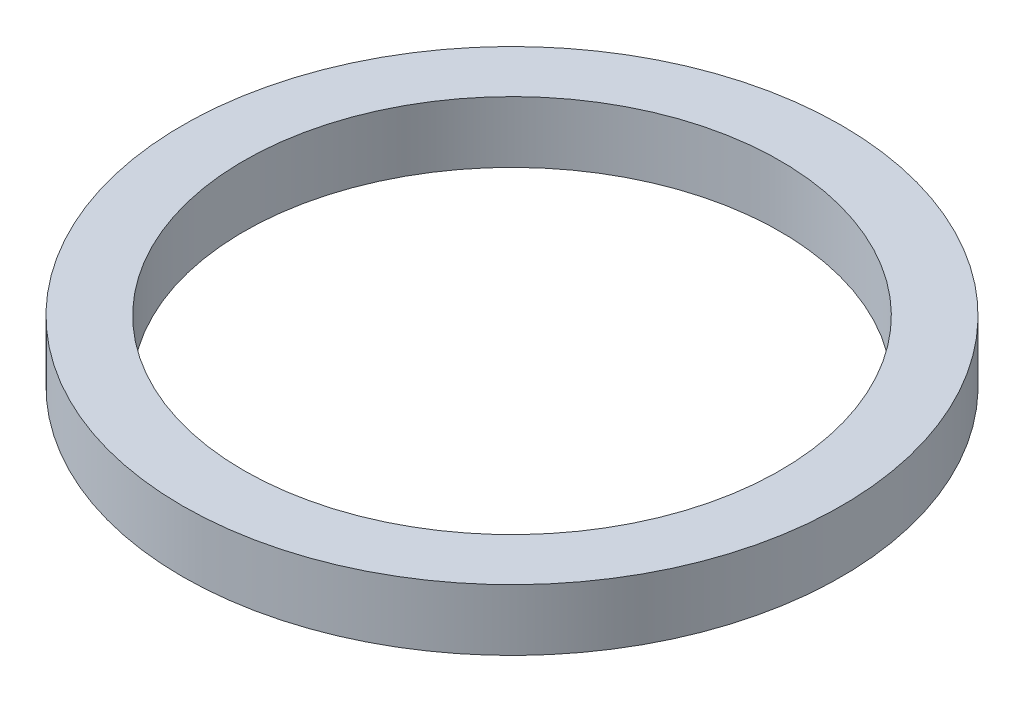
ISO-10303-21;
HEADER;
FILE_DESCRIPTION(('STEP AP214'),'2;1');
FILE_NAME('part.step','',(''),(''),'','','');
FILE_SCHEMA(('AUTOMOTIVE_DESIGN { 1 0 10303 214 1 1 1 1 }'));
ENDSEC;
DATA;
#1=APPLICATION_CONTEXT('core data for automotive mechanical design processes');
#2=APPLICATION_PROTOCOL_DEFINITION('international standard','automotive_design',2000,#1);
#3=PRODUCT_CONTEXT('',#1,'mechanical');
#4=PRODUCT('Part','Part','',(#3));
#5=PRODUCT_RELATED_PRODUCT_CATEGORY('part','',(#4));
#6=PRODUCT_DEFINITION_FORMATION('','',#4);
#7=PRODUCT_DEFINITION_CONTEXT('part definition',#1,'design');
#8=PRODUCT_DEFINITION('design','',#6,#7);
#9=PRODUCT_DEFINITION_SHAPE('','',#8);
#10=(LENGTH_UNIT() NAMED_UNIT(*) SI_UNIT(.MILLI.,.METRE.));
#11=(NAMED_UNIT(*) PLANE_ANGLE_UNIT() SI_UNIT($,.RADIAN.));
#12=(NAMED_UNIT(*) SI_UNIT($,.STERADIAN.) SOLID_ANGLE_UNIT());
#13=UNCERTAINTY_MEASURE_WITH_UNIT(LENGTH_MEASURE(1.E-05),#10,'distance_accuracy_value','');
#14=(GEOMETRIC_REPRESENTATION_CONTEXT(3) GLOBAL_UNCERTAINTY_ASSIGNED_CONTEXT((#13)) GLOBAL_UNIT_ASSIGNED_CONTEXT((#10,
#11,#12)) REPRESENTATION_CONTEXT('',''));
#15=CARTESIAN_POINT('',(0.,0.,0.));
#16=DIRECTION('',(0.,0.,1.));
#17=DIRECTION('',(1.,0.,0.));
#18=AXIS2_PLACEMENT_3D('',#15,#16,#17);
#19=CARTESIAN_POINT('',(0.,8.,0.));
#20=DIRECTION('',(0.,1.,0.));
#21=DIRECTION('',(0.,0.,1.));
#22=AXIS2_PLACEMENT_3D('',#19,#20,#21);
#23=PLANE('',#22);
#24=CARTESIAN_POINT('',(0.,8.,0.));
#25=DIRECTION('',(0.,1.,0.));
#26=DIRECTION('',(0.,0.,1.));
#27=AXIS2_PLACEMENT_3D('',#24,#25,#26);
#28=CIRCLE('',#27,43.);
#29=CARTESIAN_POINT('',(0.,8.,43.));
#30=VERTEX_POINT('',#29);
#31=EDGE_CURVE('E10',#30,#30,#28,.T.);
#32=ORIENTED_EDGE('',*,*,#31,.T.);
#33=EDGE_LOOP('',(#32));
#34=FACE_BOUND('',#33,.T.);
#35=CARTESIAN_POINT('',(0.,8.,0.));
#36=DIRECTION('',(0.,1.,0.));
#37=DIRECTION('',(0.,0.,1.));
#38=AXIS2_PLACEMENT_3D('',#35,#36,#37);
#39=CIRCLE('',#38,35.);
#40=CARTESIAN_POINT('',(0.,8.,35.));
#41=VERTEX_POINT('',#40);
#42=EDGE_CURVE('E48',#41,#41,#39,.T.);
#43=ORIENTED_EDGE('',*,*,#42,.F.);
#44=EDGE_LOOP('',(#43));
#45=FACE_BOUND('',#44,.T.);
#46=ADVANCED_FACE('F37',(#34,#45),#23,.T.);
#47=CARTESIAN_POINT('',(0.,0.,0.));
#48=DIRECTION('',(0.,1.,0.));
#49=DIRECTION('',(0.,0.,1.));
#50=AXIS2_PLACEMENT_3D('',#47,#48,#49);
#51=PLANE('',#50);
#52=CARTESIAN_POINT('',(0.,0.,0.));
#53=DIRECTION('',(0.,1.,0.));
#54=DIRECTION('',(0.,0.,1.));
#55=AXIS2_PLACEMENT_3D('',#52,#53,#54);
#56=CIRCLE('',#55,43.);
#57=CARTESIAN_POINT('',(0.,0.,43.));
#58=VERTEX_POINT('',#57);
#59=EDGE_CURVE('E41',#58,#58,#56,.T.);
#60=ORIENTED_EDGE('',*,*,#59,.F.);
#61=EDGE_LOOP('',(#60));
#62=FACE_BOUND('',#61,.T.);
#63=CARTESIAN_POINT('',(0.,0.,0.));
#64=DIRECTION('',(0.,1.,0.));
#65=DIRECTION('',(0.,0.,1.));
#66=AXIS2_PLACEMENT_3D('',#63,#64,#65);
#67=CIRCLE('',#66,35.);
#68=CARTESIAN_POINT('',(0.,0.,35.));
#69=VERTEX_POINT('',#68);
#70=EDGE_CURVE('E50',#69,#69,#67,.T.);
#71=ORIENTED_EDGE('',*,*,#70,.T.);
#72=EDGE_LOOP('',(#71));
#73=FACE_BOUND('',#72,.T.);
#74=ADVANCED_FACE('F60',(#62,#73),#51,.F.);
#75=CARTESIAN_POINT('',(0.,8.,0.));
#76=DIRECTION('',(0.,-1.,0.));
#77=DIRECTION('',(0.,0.,-1.));
#78=AXIS2_PLACEMENT_3D('',#75,#76,#77);
#79=CYLINDRICAL_SURFACE('',#78,43.);
#80=ORIENTED_EDGE('',*,*,#31,.F.);
#81=EDGE_LOOP('',(#80));
#82=FACE_BOUND('',#81,.T.);
#83=ORIENTED_EDGE('',*,*,#59,.T.);
#84=EDGE_LOOP('',(#83));
#85=FACE_BOUND('',#84,.T.);
#86=ADVANCED_FACE('F39',(#82,#85),#79,.T.);
#87=CARTESIAN_POINT('',(0.,8.,0.));
#88=DIRECTION('',(0.,-1.,0.));
#89=DIRECTION('',(0.,0.,-1.));
#90=AXIS2_PLACEMENT_3D('',#87,#88,#89);
#91=CYLINDRICAL_SURFACE('',#90,35.);
#92=ORIENTED_EDGE('',*,*,#42,.T.);
#93=EDGE_LOOP('',(#92));
#94=FACE_BOUND('',#93,.T.);
#95=ORIENTED_EDGE('',*,*,#70,.F.);
#96=EDGE_LOOP('',(#95));
#97=FACE_BOUND('',#96,.T.);
#98=ADVANCED_FACE('F56',(#94,#97),#91,.F.);
#99=CLOSED_SHELL('',(#46,#74,#86,#98));
#100=MANIFOLD_SOLID_BREP('B2',#99);
#101=ADVANCED_BREP_SHAPE_REPRESENTATION('',(#18,#100),#14);
#102=SHAPE_DEFINITION_REPRESENTATION(#9,#101);
ENDSEC;
END-ISO-10303-21;
